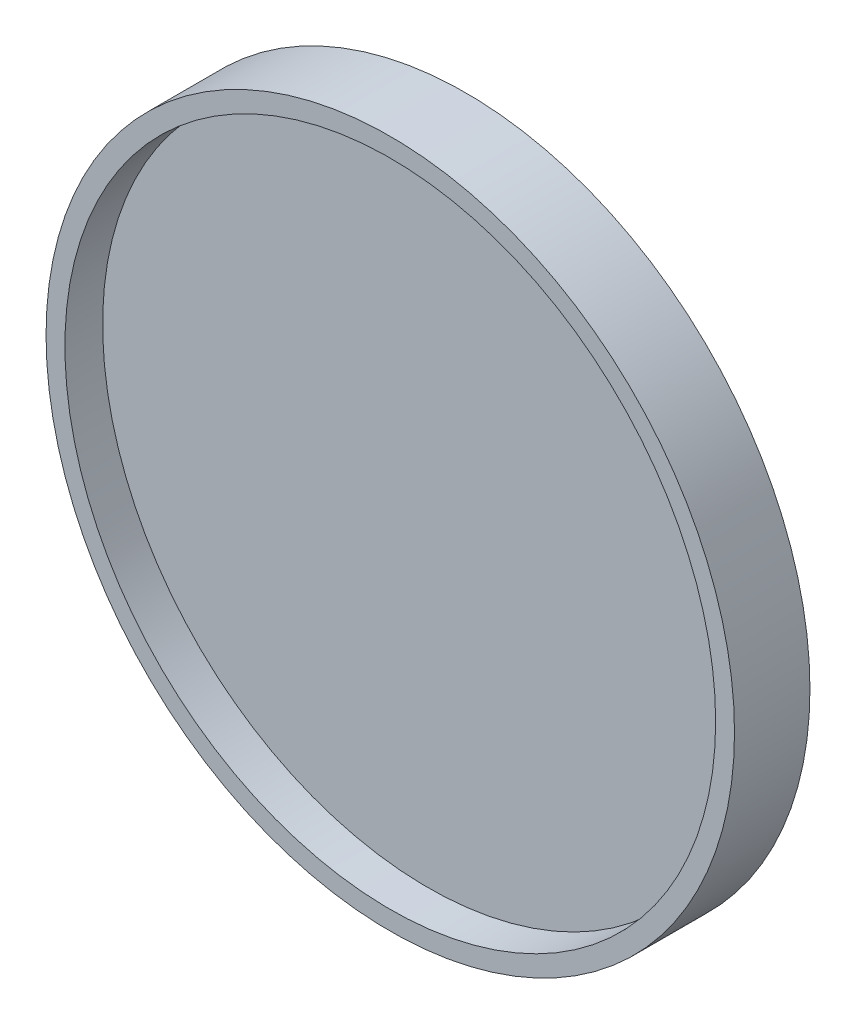
ISO-10303-21;
HEADER;
FILE_DESCRIPTION(('STEP AP214'),'2;1');
FILE_NAME('part.step','',(''),(''),'','','');
FILE_SCHEMA(('AUTOMOTIVE_DESIGN { 1 0 10303 214 1 1 1 1 }'));
ENDSEC;
DATA;
#1=APPLICATION_CONTEXT('core data for automotive mechanical design processes');
#2=APPLICATION_PROTOCOL_DEFINITION('international standard','automotive_design',2000,#1);
#3=PRODUCT_CONTEXT('',#1,'mechanical');
#4=PRODUCT('Part','Part','',(#3));
#5=PRODUCT_RELATED_PRODUCT_CATEGORY('part','',(#4));
#6=PRODUCT_DEFINITION_FORMATION('','',#4);
#7=PRODUCT_DEFINITION_CONTEXT('part definition',#1,'design');
#8=PRODUCT_DEFINITION('design','',#6,#7);
#9=PRODUCT_DEFINITION_SHAPE('','',#8);
#10=(LENGTH_UNIT() NAMED_UNIT(*) SI_UNIT(.MILLI.,.METRE.));
#11=(NAMED_UNIT(*) PLANE_ANGLE_UNIT() SI_UNIT($,.RADIAN.));
#12=(NAMED_UNIT(*) SI_UNIT($,.STERADIAN.) SOLID_ANGLE_UNIT());
#13=UNCERTAINTY_MEASURE_WITH_UNIT(LENGTH_MEASURE(1.E-05),#10,'distance_accuracy_value','');
#14=(GEOMETRIC_REPRESENTATION_CONTEXT(3) GLOBAL_UNCERTAINTY_ASSIGNED_CONTEXT((#13)) GLOBAL_UNIT_ASSIGNED_CONTEXT((#10,
#11,#12)) REPRESENTATION_CONTEXT('',''));
#15=CARTESIAN_POINT('',(0.,0.,0.));
#16=DIRECTION('',(0.,0.,1.));
#17=DIRECTION('',(1.,0.,0.));
#18=AXIS2_PLACEMENT_3D('',#15,#16,#17);
#19=CARTESIAN_POINT('',(0.,0.,5.08));
#20=DIRECTION('',(0.,0.,1.));
#21=DIRECTION('',(1.,0.,0.));
#22=AXIS2_PLACEMENT_3D('',#19,#20,#21);
#23=PLANE('',#22);
#24=CARTESIAN_POINT('',(0.,0.,5.08));
#25=DIRECTION('',(0.,0.,1.));
#26=DIRECTION('',(1.,0.,0.));
#27=AXIS2_PLACEMENT_3D('',#24,#25,#26);
#28=CIRCLE('',#27,46.355);
#29=CARTESIAN_POINT('',(46.355,0.,5.08));
#30=VERTEX_POINT('',#29);
#31=EDGE_CURVE('E10',#30,#30,#28,.T.);
#32=ORIENTED_EDGE('',*,*,#31,.T.);
#33=EDGE_LOOP('',(#32));
#34=FACE_BOUND('',#33,.T.);
#35=CARTESIAN_POINT('',(0.,0.,5.08));
#36=DIRECTION('',(0.,0.,1.));
#37=DIRECTION('',(1.,0.,0.));
#38=AXIS2_PLACEMENT_3D('',#35,#36,#37);
#39=CIRCLE('',#38,43.815);
#40=CARTESIAN_POINT('',(43.815,0.,5.08));
#41=VERTEX_POINT('',#40);
#42=EDGE_CURVE('E38',#41,#41,#39,.T.);
#43=ORIENTED_EDGE('',*,*,#42,.F.);
#44=EDGE_LOOP('',(#43));
#45=FACE_BOUND('',#44,.T.);
#46=ADVANCED_FACE('F31',(#34,#45),#23,.T.);
#47=CARTESIAN_POINT('',(0.,0.,5.08));
#48=DIRECTION('',(0.,0.,-1.));
#49=DIRECTION('',(-1.,0.,0.));
#50=AXIS2_PLACEMENT_3D('',#47,#48,#49);
#51=CYLINDRICAL_SURFACE('',#50,46.355);
#52=ORIENTED_EDGE('',*,*,#31,.F.);
#53=EDGE_LOOP('',(#52));
#54=FACE_BOUND('',#53,.T.);
#55=CARTESIAN_POINT('',(0.,0.,-5.08));
#56=DIRECTION('',(0.,0.,-1.));
#57=DIRECTION('',(-1.,0.,0.));
#58=AXIS2_PLACEMENT_3D('',#55,#56,#57);
#59=CIRCLE('',#58,46.355);
#60=CARTESIAN_POINT('',(-46.355,0.,-5.08));
#61=VERTEX_POINT('',#60);
#62=EDGE_CURVE('E47',#61,#61,#59,.T.);
#63=ORIENTED_EDGE('',*,*,#62,.F.);
#64=EDGE_LOOP('',(#63));
#65=FACE_BOUND('',#64,.T.);
#66=ADVANCED_FACE('F33',(#54,#65),#51,.T.);
#67=CARTESIAN_POINT('',(0.,0.,5.08));
#68=DIRECTION('',(0.,0.,-1.));
#69=DIRECTION('',(-1.,0.,0.));
#70=AXIS2_PLACEMENT_3D('',#67,#68,#69);
#71=CYLINDRICAL_SURFACE('',#70,43.815);
#72=ORIENTED_EDGE('',*,*,#42,.T.);
#73=EDGE_LOOP('',(#72));
#74=FACE_BOUND('',#73,.T.);
#75=CARTESIAN_POINT('',(0.,0.,0.));
#76=DIRECTION('',(0.,0.,1.));
#77=DIRECTION('',(1.,0.,0.));
#78=AXIS2_PLACEMENT_3D('',#75,#76,#77);
#79=CIRCLE('',#78,43.815);
#80=CARTESIAN_POINT('',(43.815,0.,0.));
#81=VERTEX_POINT('',#80);
#82=EDGE_CURVE('E42',#81,#81,#79,.T.);
#83=ORIENTED_EDGE('',*,*,#82,.F.);
#84=EDGE_LOOP('',(#83));
#85=FACE_BOUND('',#84,.T.);
#86=ADVANCED_FACE('F55',(#74,#85),#71,.F.);
#87=CARTESIAN_POINT('',(0.,0.,0.));
#88=DIRECTION('',(0.,0.,-1.));
#89=DIRECTION('',(-1.,0.,0.));
#90=AXIS2_PLACEMENT_3D('',#87,#88,#89);
#91=PLANE('',#90);
#92=ORIENTED_EDGE('',*,*,#82,.T.);
#93=EDGE_LOOP('',(#92));
#94=FACE_BOUND('',#93,.T.);
#95=ADVANCED_FACE('F61',(#94),#91,.F.);
#96=CARTESIAN_POINT('',(0.,0.,-5.08));
#97=DIRECTION('',(0.,0.,-1.));
#98=DIRECTION('',(-1.,0.,0.));
#99=AXIS2_PLACEMENT_3D('',#96,#97,#98);
#100=PLANE('',#99);
#101=ORIENTED_EDGE('',*,*,#62,.T.);
#102=EDGE_LOOP('',(#101));
#103=FACE_BOUND('',#102,.T.);
#104=ADVANCED_FACE('F52',(#103),#100,.T.);
#105=CLOSED_SHELL('',(#46,#66,#86,#95,#104));
#106=MANIFOLD_SOLID_BREP('B2',#105);
#107=ADVANCED_BREP_SHAPE_REPRESENTATION('',(#18,#106),#14);
#108=SHAPE_DEFINITION_REPRESENTATION(#9,#107);
ENDSEC;
END-ISO-10303-21;
